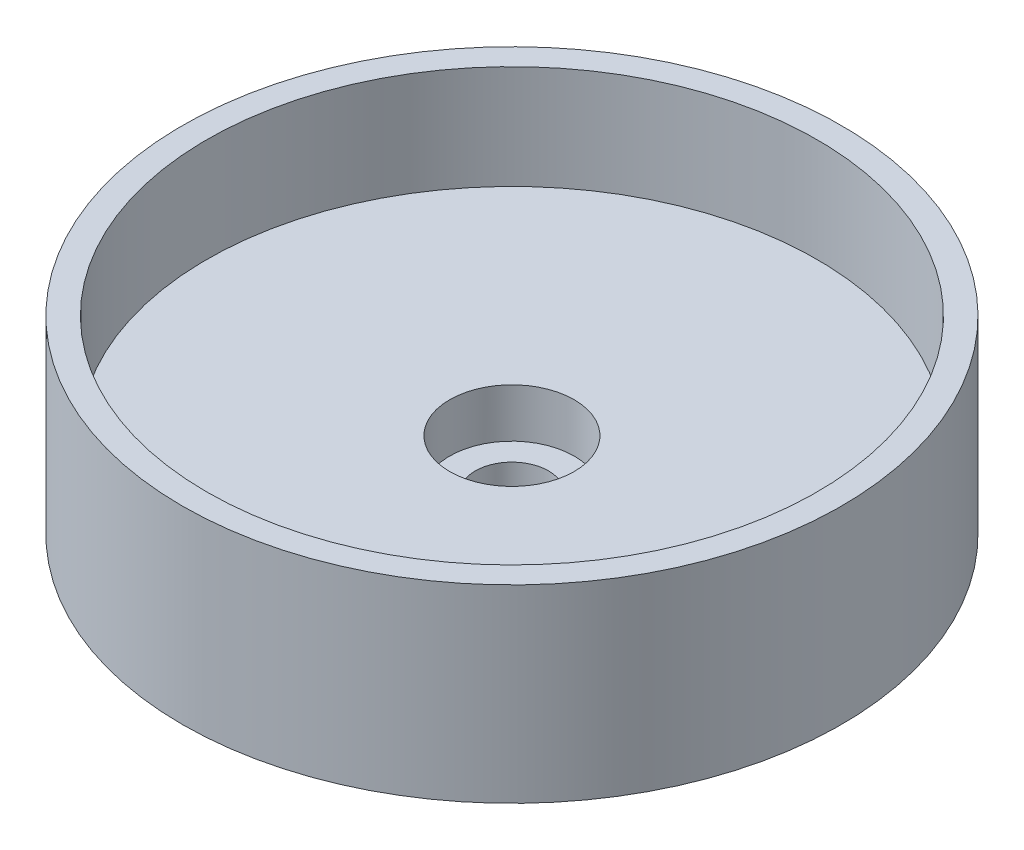
ISO-10303-21;
HEADER;
FILE_DESCRIPTION(('STEP AP214'),'2;1');
FILE_NAME('part.step','',(''),(''),'','','');
FILE_SCHEMA(('AUTOMOTIVE_DESIGN { 1 0 10303 214 1 1 1 1 }'));
ENDSEC;
DATA;
#1=APPLICATION_CONTEXT('core data for automotive mechanical design processes');
#2=APPLICATION_PROTOCOL_DEFINITION('international standard','automotive_design',2000,#1);
#3=PRODUCT_CONTEXT('',#1,'mechanical');
#4=PRODUCT('Part','Part','',(#3));
#5=PRODUCT_RELATED_PRODUCT_CATEGORY('part','',(#4));
#6=PRODUCT_DEFINITION_FORMATION('','',#4);
#7=PRODUCT_DEFINITION_CONTEXT('part definition',#1,'design');
#8=PRODUCT_DEFINITION('design','',#6,#7);
#9=PRODUCT_DEFINITION_SHAPE('','',#8);
#10=(LENGTH_UNIT() NAMED_UNIT(*) SI_UNIT(.MILLI.,.METRE.));
#11=(NAMED_UNIT(*) PLANE_ANGLE_UNIT() SI_UNIT($,.RADIAN.));
#12=(NAMED_UNIT(*) SI_UNIT($,.STERADIAN.) SOLID_ANGLE_UNIT());
#13=UNCERTAINTY_MEASURE_WITH_UNIT(LENGTH_MEASURE(1.E-05),#10,'distance_accuracy_value','');
#14=(GEOMETRIC_REPRESENTATION_CONTEXT(3) GLOBAL_UNCERTAINTY_ASSIGNED_CONTEXT((#13)) GLOBAL_UNIT_ASSIGNED_CONTEXT((#10,
#11,#12)) REPRESENTATION_CONTEXT('',''));
#15=CARTESIAN_POINT('',(0.,0.,0.));
#16=DIRECTION('',(0.,0.,1.));
#17=DIRECTION('',(1.,0.,0.));
#18=AXIS2_PLACEMENT_3D('',#15,#16,#17);
#19=CARTESIAN_POINT('',(0.,7.,0.));
#20=DIRECTION('',(0.,-1.,0.));
#21=DIRECTION('',(0.,0.,-1.));
#22=AXIS2_PLACEMENT_3D('',#19,#20,#21);
#23=CYLINDRICAL_SURFACE('',#22,5.1);
#24=CARTESIAN_POINT('',(0.,7.,0.));
#25=DIRECTION('',(0.,1.,0.));
#26=DIRECTION('',(0.,0.,1.));
#27=AXIS2_PLACEMENT_3D('',#24,#25,#26);
#28=CIRCLE('',#27,5.1);
#29=CARTESIAN_POINT('',(0.,7.,5.1));
#30=VERTEX_POINT('',#29);
#31=EDGE_CURVE('E10',#30,#30,#28,.T.);
#32=ORIENTED_EDGE('',*,*,#31,.T.);
#33=EDGE_LOOP('',(#32));
#34=FACE_BOUND('',#33,.T.);
#35=CARTESIAN_POINT('',(0.,3.,0.));
#36=DIRECTION('',(0.,-1.,0.));
#37=DIRECTION('',(0.,0.,-1.));
#38=AXIS2_PLACEMENT_3D('',#35,#36,#37);
#39=CIRCLE('',#38,5.1);
#40=CARTESIAN_POINT('',(0.,3.,-5.1));
#41=VERTEX_POINT('',#40);
#42=EDGE_CURVE('E41',#41,#41,#39,.T.);
#43=ORIENTED_EDGE('',*,*,#42,.T.);
#44=EDGE_LOOP('',(#43));
#45=FACE_BOUND('',#44,.T.);
#46=ADVANCED_FACE('F37',(#34,#45),#23,.F.);
#47=CARTESIAN_POINT('',(0.,7.,0.));
#48=DIRECTION('',(0.,1.,0.));
#49=DIRECTION('',(0.,0.,1.));
#50=AXIS2_PLACEMENT_3D('',#47,#48,#49);
#51=PLANE('',#50);
#52=CARTESIAN_POINT('',(0.,7.00000000000001,0.));
#53=DIRECTION('',(0.,1.,0.));
#54=DIRECTION('',(0.,0.,1.));
#55=AXIS2_PLACEMENT_3D('',#52,#53,#54);
#56=CIRCLE('',#55,25.);
#57=CARTESIAN_POINT('',(0.,7.00000000000001,25.));
#58=VERTEX_POINT('',#57);
#59=EDGE_CURVE('E53',#58,#58,#56,.T.);
#60=ORIENTED_EDGE('',*,*,#59,.T.);
#61=EDGE_LOOP('',(#60));
#62=FACE_BOUND('',#61,.T.);
#63=ORIENTED_EDGE('',*,*,#31,.F.);
#64=EDGE_LOOP('',(#63));
#65=FACE_BOUND('',#64,.T.);
#66=ADVANCED_FACE('F81',(#62,#65),#51,.T.);
#67=CARTESIAN_POINT('',(0.,0.,0.));
#68=DIRECTION('',(0.,1.,0.));
#69=DIRECTION('',(0.,0.,1.));
#70=AXIS2_PLACEMENT_3D('',#67,#68,#69);
#71=PLANE('',#70);
#72=CARTESIAN_POINT('',(0.,0.,0.));
#73=DIRECTION('',(0.,-1.,0.));
#74=DIRECTION('',(0.,0.,-1.));
#75=AXIS2_PLACEMENT_3D('',#72,#73,#74);
#76=CIRCLE('',#75,3.);
#77=CARTESIAN_POINT('',(0.,0.,-3.));
#78=VERTEX_POINT('',#77);
#79=EDGE_CURVE('E50',#78,#78,#76,.T.);
#80=ORIENTED_EDGE('',*,*,#79,.F.);
#81=EDGE_LOOP('',(#80));
#82=FACE_BOUND('',#81,.T.);
#83=CARTESIAN_POINT('',(0.,0.,0.));
#84=DIRECTION('',(0.,1.,0.));
#85=DIRECTION('',(0.,0.,1.));
#86=AXIS2_PLACEMENT_3D('',#83,#84,#85);
#87=CIRCLE('',#86,27.);
#88=CARTESIAN_POINT('',(0.,0.,27.));
#89=VERTEX_POINT('',#88);
#90=EDGE_CURVE('E58',#89,#89,#87,.F.);
#91=ORIENTED_EDGE('',*,*,#90,.T.);
#92=EDGE_LOOP('',(#91));
#93=FACE_BOUND('',#92,.T.);
#94=ADVANCED_FACE('F39',(#82,#93),#71,.F.);
#95=CARTESIAN_POINT('',(0.,3.,0.));
#96=DIRECTION('',(0.,-1.,0.));
#97=DIRECTION('',(0.,0.,-1.));
#98=AXIS2_PLACEMENT_3D('',#95,#96,#97);
#99=PLANE('',#98);
#100=CARTESIAN_POINT('',(0.,3.,0.));
#101=DIRECTION('',(0.,-1.,0.));
#102=DIRECTION('',(0.,0.,-1.));
#103=AXIS2_PLACEMENT_3D('',#100,#101,#102);
#104=CIRCLE('',#103,3.);
#105=CARTESIAN_POINT('',(0.,3.,-3.));
#106=VERTEX_POINT('',#105);
#107=EDGE_CURVE('E48',#106,#106,#104,.T.);
#108=ORIENTED_EDGE('',*,*,#107,.T.);
#109=EDGE_LOOP('',(#108));
#110=FACE_BOUND('',#109,.T.);
#111=ORIENTED_EDGE('',*,*,#42,.F.);
#112=EDGE_LOOP('',(#111));
#113=FACE_BOUND('',#112,.T.);
#114=ADVANCED_FACE('F90',(#110,#113),#99,.F.);
#115=CARTESIAN_POINT('',(0.,3.,0.));
#116=DIRECTION('',(0.,-1.,0.));
#117=DIRECTION('',(0.,0.,-1.));
#118=AXIS2_PLACEMENT_3D('',#115,#116,#117);
#119=CYLINDRICAL_SURFACE('',#118,3.);
#120=ORIENTED_EDGE('',*,*,#107,.F.);
#121=EDGE_LOOP('',(#120));
#122=FACE_BOUND('',#121,.T.);
#123=ORIENTED_EDGE('',*,*,#79,.T.);
#124=EDGE_LOOP('',(#123));
#125=FACE_BOUND('',#124,.T.);
#126=ADVANCED_FACE('F92',(#122,#125),#119,.F.);
#127=CARTESIAN_POINT('',(0.,-76.3675323681471,0.));
#128=DIRECTION('',(0.,1.,0.));
#129=DIRECTION('',(0.,0.,1.));
#130=AXIS2_PLACEMENT_3D('',#127,#128,#129);
#131=CYLINDRICAL_SURFACE('',#130,27.);
#132=ORIENTED_EDGE('',*,*,#90,.F.);
#133=EDGE_LOOP('',(#132));
#134=FACE_BOUND('',#133,.T.);
#135=CARTESIAN_POINT('',(0.,15.5,0.));
#136=DIRECTION('',(0.,1.,0.));
#137=DIRECTION('',(0.,0.,1.));
#138=AXIS2_PLACEMENT_3D('',#135,#136,#137);
#139=CIRCLE('',#138,27.);
#140=CARTESIAN_POINT('',(0.,15.5,27.));
#141=VERTEX_POINT('',#140);
#142=EDGE_CURVE('E61',#141,#141,#139,.T.);
#143=ORIENTED_EDGE('',*,*,#142,.F.);
#144=EDGE_LOOP('',(#143));
#145=FACE_BOUND('',#144,.T.);
#146=ADVANCED_FACE('F77',(#134,#145),#131,.T.);
#147=CARTESIAN_POINT('',(0.,-76.3675323681471,0.));
#148=DIRECTION('',(0.,1.,0.));
#149=DIRECTION('',(0.,0.,1.));
#150=AXIS2_PLACEMENT_3D('',#147,#148,#149);
#151=CYLINDRICAL_SURFACE('',#150,25.);
#152=ORIENTED_EDGE('',*,*,#59,.F.);
#153=EDGE_LOOP('',(#152));
#154=FACE_BOUND('',#153,.T.);
#155=CARTESIAN_POINT('',(0.,15.5,0.));
#156=DIRECTION('',(0.,1.,0.));
#157=DIRECTION('',(0.,0.,1.));
#158=AXIS2_PLACEMENT_3D('',#155,#156,#157);
#159=CIRCLE('',#158,25.);
#160=CARTESIAN_POINT('',(0.,15.5,25.));
#161=VERTEX_POINT('',#160);
#162=EDGE_CURVE('E64',#161,#161,#159,.T.);
#163=ORIENTED_EDGE('',*,*,#162,.T.);
#164=EDGE_LOOP('',(#163));
#165=FACE_BOUND('',#164,.T.);
#166=ADVANCED_FACE('F68',(#154,#165),#151,.F.);
#167=CARTESIAN_POINT('',(0.,15.5,0.));
#168=DIRECTION('',(0.,1.,0.));
#169=DIRECTION('',(0.,0.,1.));
#170=AXIS2_PLACEMENT_3D('',#167,#168,#169);
#171=PLANE('',#170);
#172=ORIENTED_EDGE('',*,*,#142,.T.);
#173=EDGE_LOOP('',(#172));
#174=FACE_BOUND('',#173,.T.);
#175=ORIENTED_EDGE('',*,*,#162,.F.);
#176=EDGE_LOOP('',(#175));
#177=FACE_BOUND('',#176,.T.);
#178=ADVANCED_FACE('F70',(#174,#177),#171,.T.);
#179=CLOSED_SHELL('',(#46,#66,#94,#114,#126,#146,#166,#178));
#180=MANIFOLD_SOLID_BREP('B2',#179);
#181=ADVANCED_BREP_SHAPE_REPRESENTATION('',(#18,#180),#14);
#182=SHAPE_DEFINITION_REPRESENTATION(#9,#181);
ENDSEC;
END-ISO-10303-21;
